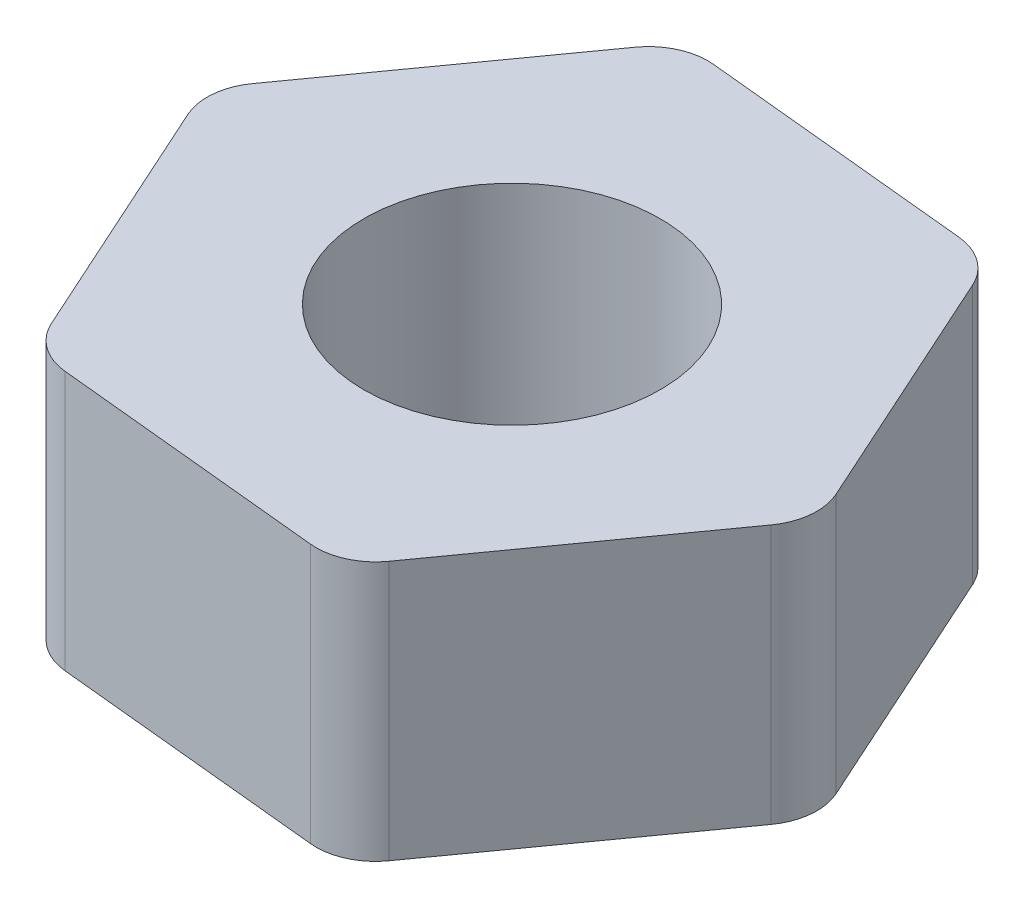
ISO-10303-21;
HEADER;
FILE_DESCRIPTION(('STEP AP214'),'2;1');
FILE_NAME('part.step','',(''),(''),'','','');
FILE_SCHEMA(('AUTOMOTIVE_DESIGN { 1 0 10303 214 1 1 1 1 }'));
ENDSEC;
DATA;
#1=APPLICATION_CONTEXT('core data for automotive mechanical design processes');
#2=APPLICATION_PROTOCOL_DEFINITION('international standard','automotive_design',2000,#1);
#3=PRODUCT_CONTEXT('',#1,'mechanical');
#4=PRODUCT('Part','Part','',(#3));
#5=PRODUCT_RELATED_PRODUCT_CATEGORY('part','',(#4));
#6=PRODUCT_DEFINITION_FORMATION('','',#4);
#7=PRODUCT_DEFINITION_CONTEXT('part definition',#1,'design');
#8=PRODUCT_DEFINITION('design','',#6,#7);
#9=PRODUCT_DEFINITION_SHAPE('','',#8);
#10=(LENGTH_UNIT() NAMED_UNIT(*) SI_UNIT(.MILLI.,.METRE.));
#11=(NAMED_UNIT(*) PLANE_ANGLE_UNIT() SI_UNIT($,.RADIAN.));
#12=(NAMED_UNIT(*) SI_UNIT($,.STERADIAN.) SOLID_ANGLE_UNIT());
#13=UNCERTAINTY_MEASURE_WITH_UNIT(LENGTH_MEASURE(1.E-05),#10,'distance_accuracy_value','');
#14=(GEOMETRIC_REPRESENTATION_CONTEXT(3) GLOBAL_UNCERTAINTY_ASSIGNED_CONTEXT((#13)) GLOBAL_UNIT_ASSIGNED_CONTEXT((#10,
#11,#12)) REPRESENTATION_CONTEXT('',''));
#15=CARTESIAN_POINT('',(0.,0.,0.));
#16=DIRECTION('',(0.,0.,1.));
#17=DIRECTION('',(1.,0.,0.));
#18=AXIS2_PLACEMENT_3D('',#15,#16,#17);
#19=CARTESIAN_POINT('',(0.,1.75,0.));
#20=DIRECTION('',(0.,1.,0.));
#21=DIRECTION('',(0.,0.,1.));
#22=AXIS2_PLACEMENT_3D('',#19,#20,#21);
#23=PLANE('',#22);
#24=DIRECTION('',(-0.582783224569959,0.,0.812627659607917));
#25=VECTOR('',#24,1.);
#26=CARTESIAN_POINT('',(-0.952315216046507,1.75,-2.10390804519105));
#27=LINE('',#26,#25);
#28=CARTESIAN_POINT('',(-1.08690323668037,1.75,-1.91623972598083));
#29=VERTEX_POINT('',#28);
#30=CARTESIAN_POINT('',(-2.1636074017513,1.75,-0.414893172299011));
#31=VERTEX_POINT('',#30);
#32=EDGE_CURVE('E230',#29,#31,#27,.T.);
#33=ORIENTED_EDGE('',*,*,#32,.T.);
#34=CARTESIAN_POINT('',(-1.83855633790813,1.75,-0.181779882471028));
#35=DIRECTION('',(0.,1.,0.));
#36=DIRECTION('',(0.,0.,1.));
#37=AXIS2_PLACEMENT_3D('',#34,#35,#36);
#38=CIRCLE('',#37,0.4);
#39=CARTESIAN_POINT('',(-2.20296390078051,1.75,-0.0168340485696798));
#40=VERTEX_POINT('',#39);
#41=EDGE_CURVE('E181',#31,#40,#38,.T.);
#42=ORIENTED_EDGE('',*,*,#41,.T.);
#43=DIRECTION('',(0.41236458475337,0.,0.911018907180955));
#44=VECTOR('',#43,1.);
#45=CARTESIAN_POINT('',(-2.29819542238516,1.75,-0.227224853088785));
#46=LINE('',#45,#44);
#47=CARTESIAN_POINT('',(-1.44111172794331,1.75,1.66629238758316));
#48=VERTEX_POINT('',#47);
#49=EDGE_CURVE('E143',#40,#48,#46,.T.);
#50=ORIENTED_EDGE('',*,*,#49,.T.);
#51=CARTESIAN_POINT('',(-1.07670416507093,1.75,1.50134655368181));
#52=DIRECTION('',(0.,1.,0.));
#53=DIRECTION('',(0.,0.,1.));
#54=AXIS2_PLACEMENT_3D('',#51,#52,#53);
#55=CIRCLE('',#54,0.4);
#56=CARTESIAN_POINT('',(-1.11606066410014,1.75,1.89940567741115));
#57=VERTEX_POINT('',#56);
#58=EDGE_CURVE('E172',#48,#57,#55,.T.);
#59=ORIENTED_EDGE('',*,*,#58,.T.);
#60=DIRECTION('',(0.995147809323329,0.,0.0983912475730375));
#61=VECTOR('',#60,1.);
#62=CARTESIAN_POINT('',(-1.34588020633866,1.75,1.87668319210227));
#63=LINE('',#62,#61);
#64=CARTESIAN_POINT('',(0.722495673807989,1.75,2.08118555988217));
#65=VERTEX_POINT('',#64);
#66=EDGE_CURVE('E150',#57,#65,#63,.T.);
#67=ORIENTED_EDGE('',*,*,#66,.T.);
#68=CARTESIAN_POINT('',(0.761852172837204,1.75,1.68312643615284));
#69=DIRECTION('',(0.,1.,0.));
#70=DIRECTION('',(0.,0.,1.));
#71=AXIS2_PLACEMENT_3D('',#68,#69,#70);
#72=CIRCLE('',#71,0.4);
#73=CARTESIAN_POINT('',(1.08690323668037,1.75,1.91623972598083));
#74=VERTEX_POINT('',#73);
#75=EDGE_CURVE('E174',#65,#74,#72,.T.);
#76=ORIENTED_EDGE('',*,*,#75,.T.);
#77=DIRECTION('',(0.582783224569959,0.,-0.812627659607917));
#78=VECTOR('',#77,1.);
#79=CARTESIAN_POINT('',(0.952315216046505,1.75,2.10390804519105));
#80=LINE('',#79,#78);
#81=CARTESIAN_POINT('',(2.1636074017513,1.75,0.414893172299011));
#82=VERTEX_POINT('',#81);
#83=EDGE_CURVE('E154',#74,#82,#80,.T.);
#84=ORIENTED_EDGE('',*,*,#83,.T.);
#85=CARTESIAN_POINT('',(1.83855633790813,1.75,0.181779882471027));
#86=DIRECTION('',(0.,1.,0.));
#87=DIRECTION('',(0.,0.,1.));
#88=AXIS2_PLACEMENT_3D('',#85,#86,#87);
#89=CIRCLE('',#88,0.4);
#90=CARTESIAN_POINT('',(2.20296390078051,1.75,0.0168340485696791));
#91=VERTEX_POINT('',#90);
#92=EDGE_CURVE('E176',#82,#91,#89,.T.);
#93=ORIENTED_EDGE('',*,*,#92,.T.);
#94=DIRECTION('',(-0.41236458475337,0.,-0.911018907180954));
#95=VECTOR('',#94,1.);
#96=CARTESIAN_POINT('',(2.29819542238516,1.75,0.227224853088784));
#97=LINE('',#96,#95);
#98=CARTESIAN_POINT('',(1.44111172794331,1.75,-1.66629238758316));
#99=VERTEX_POINT('',#98);
#100=EDGE_CURVE('E234',#91,#99,#97,.T.);
#101=ORIENTED_EDGE('',*,*,#100,.T.);
#102=CARTESIAN_POINT('',(1.07670416507092,1.75,-1.50134655368181));
#103=DIRECTION('',(0.,1.,0.));
#104=DIRECTION('',(0.,0.,1.));
#105=AXIS2_PLACEMENT_3D('',#102,#103,#104);
#106=CIRCLE('',#105,0.4);
#107=CARTESIAN_POINT('',(1.11606066410014,1.75,-1.89940567741115));
#108=VERTEX_POINT('',#107);
#109=EDGE_CURVE('E55',#99,#108,#106,.T.);
#110=ORIENTED_EDGE('',*,*,#109,.T.);
#111=DIRECTION('',(-0.995147809323329,0.,-0.0983912475730374));
#112=VECTOR('',#111,1.);
#113=CARTESIAN_POINT('',(1.34588020633865,1.75,-1.87668319210227));
#114=LINE('',#113,#112);
#115=CARTESIAN_POINT('',(-0.72249567380799,1.75,-2.08118555988217));
#116=VERTEX_POINT('',#115);
#117=EDGE_CURVE('E231',#108,#116,#114,.T.);
#118=ORIENTED_EDGE('',*,*,#117,.T.);
#119=CARTESIAN_POINT('',(-0.761852172837205,1.75,-1.68312643615284));
#120=DIRECTION('',(0.,1.,0.));
#121=DIRECTION('',(0.,0.,1.));
#122=AXIS2_PLACEMENT_3D('',#119,#120,#121);
#123=CIRCLE('',#122,0.4);
#124=EDGE_CURVE('E179',#116,#29,#123,.T.);
#125=ORIENTED_EDGE('',*,*,#124,.T.);
#126=EDGE_LOOP('',(#33,#42,#50,#59,#67,#76,#84,#93,#101,#110,#118,#125));
#127=FACE_BOUND('',#126,.T.);
#128=CARTESIAN_POINT('',(0.,1.75,0.));
#129=DIRECTION('',(0.,1.,0.));
#130=DIRECTION('',(0.,0.,1.));
#131=AXIS2_PLACEMENT_3D('',#128,#129,#130);
#132=CIRCLE('',#131,1.);
#133=CARTESIAN_POINT('',(0.,1.75,1.));
#134=VERTEX_POINT('',#133);
#135=EDGE_CURVE('E208',#134,#134,#132,.T.);
#136=ORIENTED_EDGE('',*,*,#135,.F.);
#137=EDGE_LOOP('',(#136));
#138=FACE_BOUND('',#137,.T.);
#139=ADVANCED_FACE('F33',(#127,#138),#23,.T.);
#140=CARTESIAN_POINT('',(0.,0.,0.));
#141=DIRECTION('',(0.,1.,0.));
#142=DIRECTION('',(0.,0.,1.));
#143=AXIS2_PLACEMENT_3D('',#140,#141,#142);
#144=PLANE('',#143);
#145=DIRECTION('',(0.41236458475337,0.,0.911018907180955));
#146=VECTOR('',#145,1.);
#147=CARTESIAN_POINT('',(-2.29819542238516,0.,-0.227224853088785));
#148=LINE('',#147,#146);
#149=CARTESIAN_POINT('',(-2.20296390078051,0.,-0.0168340485696798));
#150=VERTEX_POINT('',#149);
#151=CARTESIAN_POINT('',(-1.44111172794331,0.,1.66629238758316));
#152=VERTEX_POINT('',#151);
#153=EDGE_CURVE('E140',#150,#152,#148,.T.);
#154=ORIENTED_EDGE('',*,*,#153,.F.);
#155=CARTESIAN_POINT('',(-1.83855633790813,0.,-0.181779882471028));
#156=DIRECTION('',(0.,1.,0.));
#157=DIRECTION('',(0.,0.,1.));
#158=AXIS2_PLACEMENT_3D('',#155,#156,#157);
#159=CIRCLE('',#158,0.4);
#160=CARTESIAN_POINT('',(-2.1636074017513,0.,-0.414893172299011));
#161=VERTEX_POINT('',#160);
#162=EDGE_CURVE('E123',#150,#161,#159,.F.);
#163=ORIENTED_EDGE('',*,*,#162,.T.);
#164=DIRECTION('',(-0.582783224569959,0.,0.812627659607917));
#165=VECTOR('',#164,1.);
#166=CARTESIAN_POINT('',(-0.952315216046507,0.,-2.10390804519105));
#167=LINE('',#166,#165);
#168=CARTESIAN_POINT('',(-1.08690323668037,0.,-1.91623972598083));
#169=VERTEX_POINT('',#168);
#170=EDGE_CURVE('E151',#169,#161,#167,.T.);
#171=ORIENTED_EDGE('',*,*,#170,.F.);
#172=CARTESIAN_POINT('',(-0.761852172837205,0.,-1.68312643615284));
#173=DIRECTION('',(0.,1.,0.));
#174=DIRECTION('',(0.,0.,1.));
#175=AXIS2_PLACEMENT_3D('',#172,#173,#174);
#176=CIRCLE('',#175,0.4);
#177=CARTESIAN_POINT('',(-0.72249567380799,0.,-2.08118555988217));
#178=VERTEX_POINT('',#177);
#179=EDGE_CURVE('E134',#169,#178,#176,.F.);
#180=ORIENTED_EDGE('',*,*,#179,.T.);
#181=DIRECTION('',(-0.995147809323329,0.,-0.0983912475730374));
#182=VECTOR('',#181,1.);
#183=CARTESIAN_POINT('',(1.34588020633865,0.,-1.87668319210227));
#184=LINE('',#183,#182);
#185=CARTESIAN_POINT('',(1.11606066410014,0.,-1.89940567741115));
#186=VERTEX_POINT('',#185);
#187=EDGE_CURVE('E156',#186,#178,#184,.T.);
#188=ORIENTED_EDGE('',*,*,#187,.F.);
#189=CARTESIAN_POINT('',(1.07670416507092,0.,-1.50134655368181));
#190=DIRECTION('',(0.,1.,0.));
#191=DIRECTION('',(0.,0.,1.));
#192=AXIS2_PLACEMENT_3D('',#189,#190,#191);
#193=CIRCLE('',#192,0.4);
#194=CARTESIAN_POINT('',(1.44111172794331,0.,-1.66629238758316));
#195=VERTEX_POINT('',#194);
#196=EDGE_CURVE('E166',#186,#195,#193,.F.);
#197=ORIENTED_EDGE('',*,*,#196,.T.);
#198=DIRECTION('',(-0.41236458475337,0.,-0.911018907180954));
#199=VECTOR('',#198,1.);
#200=CARTESIAN_POINT('',(2.29819542238516,0.,0.227224853088784));
#201=LINE('',#200,#199);
#202=CARTESIAN_POINT('',(2.20296390078051,0.,0.0168340485696791));
#203=VERTEX_POINT('',#202);
#204=EDGE_CURVE('E211',#203,#195,#201,.T.);
#205=ORIENTED_EDGE('',*,*,#204,.F.);
#206=CARTESIAN_POINT('',(1.83855633790813,0.,0.181779882471027));
#207=DIRECTION('',(0.,1.,0.));
#208=DIRECTION('',(0.,0.,1.));
#209=AXIS2_PLACEMENT_3D('',#206,#207,#208);
#210=CIRCLE('',#209,0.4);
#211=CARTESIAN_POINT('',(2.1636074017513,0.,0.414893172299011));
#212=VERTEX_POINT('',#211);
#213=EDGE_CURVE('E164',#203,#212,#210,.F.);
#214=ORIENTED_EDGE('',*,*,#213,.T.);
#215=DIRECTION('',(0.582783224569959,0.,-0.812627659607917));
#216=VECTOR('',#215,1.);
#217=CARTESIAN_POINT('',(0.952315216046505,0.,2.10390804519105));
#218=LINE('',#217,#216);
#219=CARTESIAN_POINT('',(1.08690323668037,0.,1.91623972598083));
#220=VERTEX_POINT('',#219);
#221=EDGE_CURVE('E207',#220,#212,#218,.T.);
#222=ORIENTED_EDGE('',*,*,#221,.F.);
#223=CARTESIAN_POINT('',(0.761852172837204,0.,1.68312643615284));
#224=DIRECTION('',(0.,1.,0.));
#225=DIRECTION('',(0.,0.,1.));
#226=AXIS2_PLACEMENT_3D('',#223,#224,#225);
#227=CIRCLE('',#226,0.4);
#228=CARTESIAN_POINT('',(0.722495673807989,0.,2.08118555988217));
#229=VERTEX_POINT('',#228);
#230=EDGE_CURVE('E162',#220,#229,#227,.F.);
#231=ORIENTED_EDGE('',*,*,#230,.T.);
#232=DIRECTION('',(0.995147809323329,0.,0.0983912475730375));
#233=VECTOR('',#232,1.);
#234=CARTESIAN_POINT('',(-1.34588020633866,0.,1.87668319210227));
#235=LINE('',#234,#233);
#236=CARTESIAN_POINT('',(-1.11606066410014,0.,1.89940567741115));
#237=VERTEX_POINT('',#236);
#238=EDGE_CURVE('E202',#237,#229,#235,.T.);
#239=ORIENTED_EDGE('',*,*,#238,.F.);
#240=CARTESIAN_POINT('',(-1.07670416507093,0.,1.50134655368181));
#241=DIRECTION('',(0.,1.,0.));
#242=DIRECTION('',(0.,0.,1.));
#243=AXIS2_PLACEMENT_3D('',#240,#241,#242);
#244=CIRCLE('',#243,0.4);
#245=EDGE_CURVE('E144',#237,#152,#244,.F.);
#246=ORIENTED_EDGE('',*,*,#245,.T.);
#247=EDGE_LOOP('',(#154,#163,#171,#180,#188,#197,#205,#214,#222,#231,#239,#246));
#248=FACE_BOUND('',#247,.T.);
#249=CARTESIAN_POINT('',(0.,0.,0.));
#250=DIRECTION('',(0.,1.,0.));
#251=DIRECTION('',(0.,0.,1.));
#252=AXIS2_PLACEMENT_3D('',#249,#250,#251);
#253=CIRCLE('',#252,1.);
#254=CARTESIAN_POINT('',(0.,0.,1.));
#255=VERTEX_POINT('',#254);
#256=EDGE_CURVE('E214',#255,#255,#253,.T.);
#257=ORIENTED_EDGE('',*,*,#256,.T.);
#258=EDGE_LOOP('',(#257));
#259=FACE_BOUND('',#258,.T.);
#260=ADVANCED_FACE('F147',(#248,#259),#144,.F.);
#261=CARTESIAN_POINT('',(-1.34588020633866,1.75,1.87668319210227));
#262=DIRECTION('',(0.0983912475730375,0.,-0.995147809323329));
#263=DIRECTION('',(-0.995147809323329,0.,-0.0983912475730375));
#264=AXIS2_PLACEMENT_3D('',#261,#262,#263);
#265=PLANE('',#264);
#266=ORIENTED_EDGE('',*,*,#238,.T.);
#267=DIRECTION('',(0.,-1.,0.));
#268=VECTOR('',#267,1.);
#269=CARTESIAN_POINT('',(0.722495673807989,1.75,2.08118555988217));
#270=LINE('',#269,#268);
#271=EDGE_CURVE('E11',#229,#65,#270,.F.);
#272=ORIENTED_EDGE('',*,*,#271,.T.);
#273=ORIENTED_EDGE('',*,*,#66,.F.);
#274=DIRECTION('',(0.,-1.,0.));
#275=VECTOR('',#274,1.);
#276=CARTESIAN_POINT('',(-1.11606066410014,1.75,1.89940567741115));
#277=LINE('',#276,#275);
#278=EDGE_CURVE('E41',#57,#237,#277,.T.);
#279=ORIENTED_EDGE('',*,*,#278,.T.);
#280=EDGE_LOOP('',(#266,#272,#273,#279));
#281=FACE_BOUND('',#280,.T.);
#282=ADVANCED_FACE('F201',(#281),#265,.F.);
#283=CARTESIAN_POINT('',(0.952315216046505,1.75,2.10390804519105));
#284=DIRECTION('',(-0.812627659607917,0.,-0.582783224569959));
#285=DIRECTION('',(-0.582783224569959,0.,0.812627659607917));
#286=AXIS2_PLACEMENT_3D('',#283,#284,#285);
#287=PLANE('',#286);
#288=ORIENTED_EDGE('',*,*,#221,.T.);
#289=DIRECTION('',(0.,-1.,0.));
#290=VECTOR('',#289,1.);
#291=CARTESIAN_POINT('',(2.1636074017513,1.75,0.414893172299011));
#292=LINE('',#291,#290);
#293=EDGE_CURVE('E195',#212,#82,#292,.F.);
#294=ORIENTED_EDGE('',*,*,#293,.T.);
#295=ORIENTED_EDGE('',*,*,#83,.F.);
#296=DIRECTION('',(0.,-1.,0.));
#297=VECTOR('',#296,1.);
#298=CARTESIAN_POINT('',(1.08690323668037,1.75,1.91623972598083));
#299=LINE('',#298,#297);
#300=EDGE_CURVE('E192',#74,#220,#299,.T.);
#301=ORIENTED_EDGE('',*,*,#300,.T.);
#302=EDGE_LOOP('',(#288,#294,#295,#301));
#303=FACE_BOUND('',#302,.T.);
#304=ADVANCED_FACE('F267',(#303),#287,.F.);
#305=CARTESIAN_POINT('',(2.29819542238516,1.75,0.227224853088784));
#306=DIRECTION('',(-0.911018907180954,0.,0.41236458475337));
#307=DIRECTION('',(0.41236458475337,0.,0.911018907180955));
#308=AXIS2_PLACEMENT_3D('',#305,#306,#307);
#309=PLANE('',#308);
#310=ORIENTED_EDGE('',*,*,#204,.T.);
#311=DIRECTION('',(0.,-1.,0.));
#312=VECTOR('',#311,1.);
#313=CARTESIAN_POINT('',(1.44111172794331,1.75,-1.66629238758316));
#314=LINE('',#313,#312);
#315=EDGE_CURVE('E190',#195,#99,#314,.F.);
#316=ORIENTED_EDGE('',*,*,#315,.T.);
#317=ORIENTED_EDGE('',*,*,#100,.F.);
#318=DIRECTION('',(0.,-1.,0.));
#319=VECTOR('',#318,1.);
#320=CARTESIAN_POINT('',(2.20296390078051,1.75,0.0168340485696791));
#321=LINE('',#320,#319);
#322=EDGE_CURVE('E187',#91,#203,#321,.T.);
#323=ORIENTED_EDGE('',*,*,#322,.T.);
#324=EDGE_LOOP('',(#310,#316,#317,#323));
#325=FACE_BOUND('',#324,.T.);
#326=ADVANCED_FACE('F264',(#325),#309,.F.);
#327=CARTESIAN_POINT('',(1.34588020633865,1.75,-1.87668319210227));
#328=DIRECTION('',(-0.0983912475730374,0.,0.995147809323329));
#329=DIRECTION('',(0.995147809323329,0.,0.0983912475730374));
#330=AXIS2_PLACEMENT_3D('',#327,#328,#329);
#331=PLANE('',#330);
#332=ORIENTED_EDGE('',*,*,#187,.T.);
#333=DIRECTION('',(0.,-1.,0.));
#334=VECTOR('',#333,1.);
#335=CARTESIAN_POINT('',(-0.72249567380799,1.75,-2.08118555988217));
#336=LINE('',#335,#334);
#337=EDGE_CURVE('E48',#178,#116,#336,.F.);
#338=ORIENTED_EDGE('',*,*,#337,.T.);
#339=ORIENTED_EDGE('',*,*,#117,.F.);
#340=DIRECTION('',(0.,-1.,0.));
#341=VECTOR('',#340,1.);
#342=CARTESIAN_POINT('',(1.11606066410014,1.75,-1.89940567741115));
#343=LINE('',#342,#341);
#344=EDGE_CURVE('E183',#108,#186,#343,.T.);
#345=ORIENTED_EDGE('',*,*,#344,.T.);
#346=EDGE_LOOP('',(#332,#338,#339,#345));
#347=FACE_BOUND('',#346,.T.);
#348=ADVANCED_FACE('F221',(#347),#331,.F.);
#349=CARTESIAN_POINT('',(-0.952315216046507,1.75,-2.10390804519105));
#350=DIRECTION('',(0.812627659607917,0.,0.582783224569959));
#351=DIRECTION('',(0.582783224569959,0.,-0.812627659607917));
#352=AXIS2_PLACEMENT_3D('',#349,#350,#351);
#353=PLANE('',#352);
#354=ORIENTED_EDGE('',*,*,#170,.T.);
#355=DIRECTION('',(0.,-1.,0.));
#356=VECTOR('',#355,1.);
#357=CARTESIAN_POINT('',(-2.1636074017513,1.75,-0.414893172299012));
#358=LINE('',#357,#356);
#359=EDGE_CURVE('E128',#161,#31,#358,.F.);
#360=ORIENTED_EDGE('',*,*,#359,.T.);
#361=ORIENTED_EDGE('',*,*,#32,.F.);
#362=DIRECTION('',(0.,-1.,0.));
#363=VECTOR('',#362,1.);
#364=CARTESIAN_POINT('',(-1.08690323668037,1.75,-1.91623972598083));
#365=LINE('',#364,#363);
#366=EDGE_CURVE('E133',#29,#169,#365,.T.);
#367=ORIENTED_EDGE('',*,*,#366,.T.);
#368=EDGE_LOOP('',(#354,#360,#361,#367));
#369=FACE_BOUND('',#368,.T.);
#370=ADVANCED_FACE('F233',(#369),#353,.F.);
#371=CARTESIAN_POINT('',(-2.29819542238516,1.75,-0.227224853088785));
#372=DIRECTION('',(0.911018907180955,0.,-0.41236458475337));
#373=DIRECTION('',(-0.41236458475337,0.,-0.911018907180955));
#374=AXIS2_PLACEMENT_3D('',#371,#372,#373);
#375=PLANE('',#374);
#376=ORIENTED_EDGE('',*,*,#49,.F.);
#377=DIRECTION('',(0.,-1.,0.));
#378=VECTOR('',#377,1.);
#379=CARTESIAN_POINT('',(-2.20296390078051,1.75,-0.0168340485696798));
#380=LINE('',#379,#378);
#381=EDGE_CURVE('E127',#40,#150,#380,.T.);
#382=ORIENTED_EDGE('',*,*,#381,.T.);
#383=ORIENTED_EDGE('',*,*,#153,.T.);
#384=DIRECTION('',(0.,-1.,0.));
#385=VECTOR('',#384,1.);
#386=CARTESIAN_POINT('',(-1.44111172794331,1.75,1.66629238758316));
#387=LINE('',#386,#385);
#388=EDGE_CURVE('E145',#152,#48,#387,.F.);
#389=ORIENTED_EDGE('',*,*,#388,.T.);
#390=EDGE_LOOP('',(#376,#382,#383,#389));
#391=FACE_BOUND('',#390,.T.);
#392=ADVANCED_FACE('F139',(#391),#375,.F.);
#393=CARTESIAN_POINT('',(-1.83855633790813,1.75,-0.181779882471028));
#394=DIRECTION('',(0.,-1.,0.));
#395=DIRECTION('',(0.,0.,-1.));
#396=AXIS2_PLACEMENT_3D('',#393,#394,#395);
#397=CYLINDRICAL_SURFACE('',#396,0.4);
#398=ORIENTED_EDGE('',*,*,#41,.F.);
#399=ORIENTED_EDGE('',*,*,#359,.F.);
#400=ORIENTED_EDGE('',*,*,#162,.F.);
#401=ORIENTED_EDGE('',*,*,#381,.F.);
#402=EDGE_LOOP('',(#398,#399,#400,#401));
#403=FACE_BOUND('',#402,.T.);
#404=ADVANCED_FACE('F126',(#403),#397,.T.);
#405=CARTESIAN_POINT('',(-0.761852172837205,1.75,-1.68312643615284));
#406=DIRECTION('',(0.,-1.,0.));
#407=DIRECTION('',(0.,0.,-1.));
#408=AXIS2_PLACEMENT_3D('',#405,#406,#407);
#409=CYLINDRICAL_SURFACE('',#408,0.4);
#410=ORIENTED_EDGE('',*,*,#124,.F.);
#411=ORIENTED_EDGE('',*,*,#337,.F.);
#412=ORIENTED_EDGE('',*,*,#179,.F.);
#413=ORIENTED_EDGE('',*,*,#366,.F.);
#414=EDGE_LOOP('',(#410,#411,#412,#413));
#415=FACE_BOUND('',#414,.T.);
#416=ADVANCED_FACE('F225',(#415),#409,.T.);
#417=CARTESIAN_POINT('',(1.07670416507092,1.75,-1.50134655368181));
#418=DIRECTION('',(0.,-1.,0.));
#419=DIRECTION('',(0.,0.,-1.));
#420=AXIS2_PLACEMENT_3D('',#417,#418,#419);
#421=CYLINDRICAL_SURFACE('',#420,0.4);
#422=ORIENTED_EDGE('',*,*,#109,.F.);
#423=ORIENTED_EDGE('',*,*,#315,.F.);
#424=ORIENTED_EDGE('',*,*,#196,.F.);
#425=ORIENTED_EDGE('',*,*,#344,.F.);
#426=EDGE_LOOP('',(#422,#423,#424,#425));
#427=FACE_BOUND('',#426,.T.);
#428=ADVANCED_FACE('F278',(#427),#421,.T.);
#429=CARTESIAN_POINT('',(1.83855633790813,1.75,0.181779882471027));
#430=DIRECTION('',(0.,-1.,0.));
#431=DIRECTION('',(0.,0.,-1.));
#432=AXIS2_PLACEMENT_3D('',#429,#430,#431);
#433=CYLINDRICAL_SURFACE('',#432,0.4);
#434=ORIENTED_EDGE('',*,*,#92,.F.);
#435=ORIENTED_EDGE('',*,*,#293,.F.);
#436=ORIENTED_EDGE('',*,*,#213,.F.);
#437=ORIENTED_EDGE('',*,*,#322,.F.);
#438=EDGE_LOOP('',(#434,#435,#436,#437));
#439=FACE_BOUND('',#438,.T.);
#440=ADVANCED_FACE('F281',(#439),#433,.T.);
#441=CARTESIAN_POINT('',(0.761852172837204,1.75,1.68312643615284));
#442=DIRECTION('',(0.,-1.,0.));
#443=DIRECTION('',(0.,0.,-1.));
#444=AXIS2_PLACEMENT_3D('',#441,#442,#443);
#445=CYLINDRICAL_SURFACE('',#444,0.4);
#446=ORIENTED_EDGE('',*,*,#75,.F.);
#447=ORIENTED_EDGE('',*,*,#271,.F.);
#448=ORIENTED_EDGE('',*,*,#230,.F.);
#449=ORIENTED_EDGE('',*,*,#300,.F.);
#450=EDGE_LOOP('',(#446,#447,#448,#449));
#451=FACE_BOUND('',#450,.T.);
#452=ADVANCED_FACE('F250',(#451),#445,.T.);
#453=CARTESIAN_POINT('',(-1.07670416507093,1.75,1.50134655368181));
#454=DIRECTION('',(0.,-1.,0.));
#455=DIRECTION('',(0.,0.,-1.));
#456=AXIS2_PLACEMENT_3D('',#453,#454,#455);
#457=CYLINDRICAL_SURFACE('',#456,0.4);
#458=ORIENTED_EDGE('',*,*,#58,.F.);
#459=ORIENTED_EDGE('',*,*,#388,.F.);
#460=ORIENTED_EDGE('',*,*,#245,.F.);
#461=ORIENTED_EDGE('',*,*,#278,.F.);
#462=EDGE_LOOP('',(#458,#459,#460,#461));
#463=FACE_BOUND('',#462,.T.);
#464=ADVANCED_FACE('F35',(#463),#457,.T.);
#465=CARTESIAN_POINT('',(0.,1.75,0.));
#466=DIRECTION('',(0.,-1.,0.));
#467=DIRECTION('',(0.,0.,-1.));
#468=AXIS2_PLACEMENT_3D('',#465,#466,#467);
#469=CYLINDRICAL_SURFACE('',#468,1.);
#470=ORIENTED_EDGE('',*,*,#135,.T.);
#471=EDGE_LOOP('',(#470));
#472=FACE_BOUND('',#471,.T.);
#473=ORIENTED_EDGE('',*,*,#256,.F.);
#474=EDGE_LOOP('',(#473));
#475=FACE_BOUND('',#474,.T.);
#476=ADVANCED_FACE('F243',(#472,#475),#469,.F.);
#477=CLOSED_SHELL('',(#139,#260,#282,#304,#326,#348,#370,#392,#404,#416,#428,#440,#452,#464,#476));
#478=MANIFOLD_SOLID_BREP('B2',#477);
#479=ADVANCED_BREP_SHAPE_REPRESENTATION('',(#18,#478),#14);
#480=SHAPE_DEFINITION_REPRESENTATION(#9,#479);
ENDSEC;
END-ISO-10303-21;
